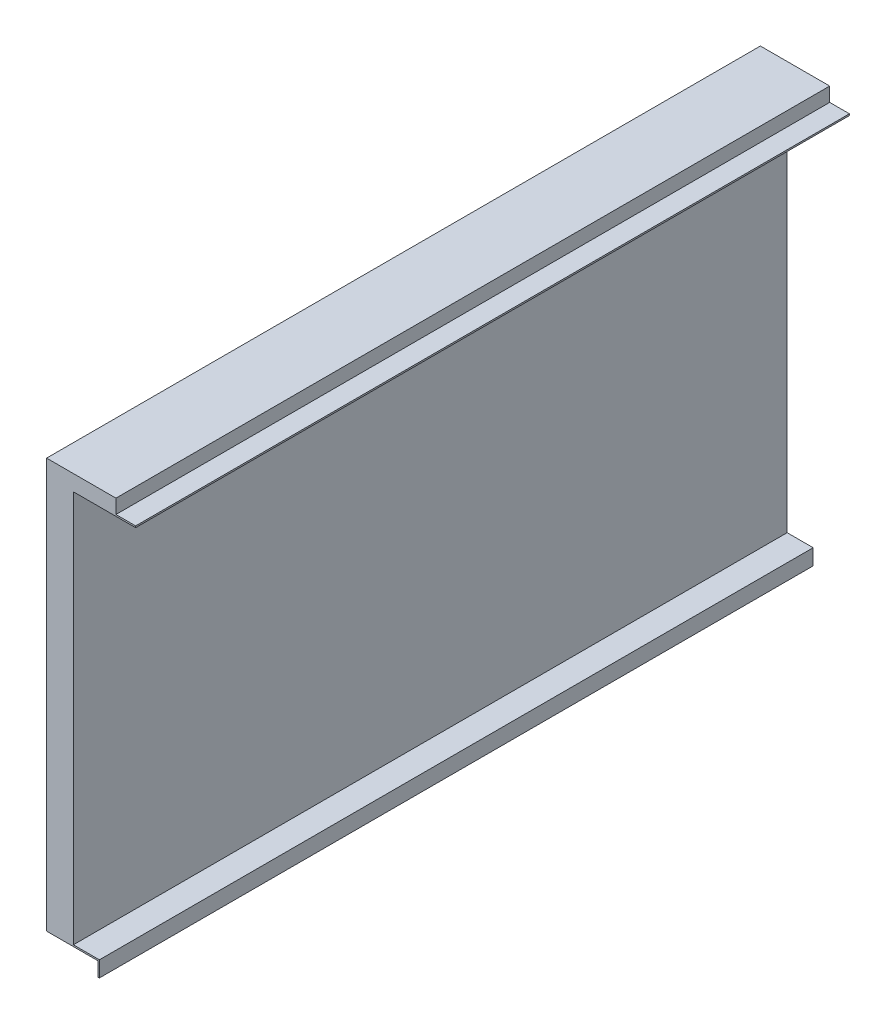
ISO-10303-21;
HEADER;
FILE_DESCRIPTION(('STEP AP214'),'2;1');
FILE_NAME('part.step','',(''),(''),'','','');
FILE_SCHEMA(('AUTOMOTIVE_DESIGN { 1 0 10303 214 1 1 1 1 }'));
ENDSEC;
DATA;
#1=APPLICATION_CONTEXT('core data for automotive mechanical design processes');
#2=APPLICATION_PROTOCOL_DEFINITION('international standard','automotive_design',2000,#1);
#3=PRODUCT_CONTEXT('',#1,'mechanical');
#4=PRODUCT('Part','Part','',(#3));
#5=PRODUCT_RELATED_PRODUCT_CATEGORY('part','',(#4));
#6=PRODUCT_DEFINITION_FORMATION('','',#4);
#7=PRODUCT_DEFINITION_CONTEXT('part definition',#1,'design');
#8=PRODUCT_DEFINITION('design','',#6,#7);
#9=PRODUCT_DEFINITION_SHAPE('','',#8);
#10=(LENGTH_UNIT() NAMED_UNIT(*) SI_UNIT(.MILLI.,.METRE.));
#11=(NAMED_UNIT(*) PLANE_ANGLE_UNIT() SI_UNIT($,.RADIAN.));
#12=(NAMED_UNIT(*) SI_UNIT($,.STERADIAN.) SOLID_ANGLE_UNIT());
#13=UNCERTAINTY_MEASURE_WITH_UNIT(LENGTH_MEASURE(1.E-05),#10,'distance_accuracy_value','');
#14=(GEOMETRIC_REPRESENTATION_CONTEXT(3) GLOBAL_UNCERTAINTY_ASSIGNED_CONTEXT((#13)) GLOBAL_UNIT_ASSIGNED_CONTEXT((#10,
#11,#12)) REPRESENTATION_CONTEXT('',''));
#15=CARTESIAN_POINT('',(0.,0.,0.));
#16=DIRECTION('',(0.,0.,1.));
#17=DIRECTION('',(1.,0.,0.));
#18=AXIS2_PLACEMENT_3D('',#15,#16,#17);
#19=CARTESIAN_POINT('',(-1370.,836.,1104.));
#20=DIRECTION('',(0.,0.,1.));
#21=DIRECTION('',(0.,-1.,0.));
#22=AXIS2_PLACEMENT_3D('',#19,#20,#21);
#23=PLANE('',#22);
#24=DIRECTION('',(-1.,0.,0.));
#25=VECTOR('',#24,1.);
#26=CARTESIAN_POINT('',(-1282.,1096.,1104.));
#27=LINE('',#26,#25);
#28=CARTESIAN_POINT('',(-1282.,1096.,1104.));
#29=VERTEX_POINT('',#28);
#30=CARTESIAN_POINT('',(-1370.,1096.,1104.));
#31=VERTEX_POINT('',#30);
#32=EDGE_CURVE('E95',#29,#31,#27,.T.);
#33=ORIENTED_EDGE('',*,*,#32,.F.);
#34=DIRECTION('',(0.,1.,0.));
#35=VECTOR('',#34,1.);
#36=CARTESIAN_POINT('',(-1282.,1078.,1104.));
#37=LINE('',#36,#35);
#38=CARTESIAN_POINT('',(-1282.,1078.,1104.));
#39=VERTEX_POINT('',#38);
#40=EDGE_CURVE('E36',#39,#29,#37,.T.);
#41=ORIENTED_EDGE('',*,*,#40,.F.);
#42=DIRECTION('',(-1.,0.,0.));
#43=VECTOR('',#42,1.);
#44=CARTESIAN_POINT('',(-1257.,1078.,1104.));
#45=LINE('',#44,#43);
#46=CARTESIAN_POINT('',(-1257.,1078.,1104.));
#47=VERTEX_POINT('',#46);
#48=EDGE_CURVE('E194',#47,#39,#45,.T.);
#49=ORIENTED_EDGE('',*,*,#48,.F.);
#50=DIRECTION('',(0.,1.,0.));
#51=VECTOR('',#50,1.);
#52=CARTESIAN_POINT('',(-1257.,1076.,1104.));
#53=LINE('',#52,#51);
#54=CARTESIAN_POINT('',(-1257.,1076.,1104.));
#55=VERTEX_POINT('',#54);
#56=EDGE_CURVE('E190',#55,#47,#53,.T.);
#57=ORIENTED_EDGE('',*,*,#56,.F.);
#58=DIRECTION('',(1.,0.,0.));
#59=VECTOR('',#58,1.);
#60=CARTESIAN_POINT('',(-1336.,1076.,1104.));
#61=LINE('',#60,#59);
#62=CARTESIAN_POINT('',(-1336.,1076.,1104.));
#63=VERTEX_POINT('',#62);
#64=EDGE_CURVE('E155',#63,#55,#61,.T.);
#65=ORIENTED_EDGE('',*,*,#64,.F.);
#66=DIRECTION('',(0.,1.,0.));
#67=VECTOR('',#66,1.);
#68=CARTESIAN_POINT('',(-1336.,578.,1104.));
#69=LINE('',#68,#67);
#70=CARTESIAN_POINT('',(-1336.,578.,1104.));
#71=VERTEX_POINT('',#70);
#72=EDGE_CURVE('E149',#71,#63,#69,.T.);
#73=ORIENTED_EDGE('',*,*,#72,.F.);
#74=DIRECTION('',(-1.,0.,0.));
#75=VECTOR('',#74,1.);
#76=CARTESIAN_POINT('',(-1303.,578.,1104.));
#77=LINE('',#76,#75);
#78=CARTESIAN_POINT('',(-1303.,578.,1104.));
#79=VERTEX_POINT('',#78);
#80=EDGE_CURVE('E146',#79,#71,#77,.T.);
#81=ORIENTED_EDGE('',*,*,#80,.F.);
#82=DIRECTION('',(0.,1.,0.));
#83=VECTOR('',#82,1.);
#84=CARTESIAN_POINT('',(-1303.,558.,1104.));
#85=LINE('',#84,#83);
#86=CARTESIAN_POINT('',(-1303.,558.,1104.));
#87=VERTEX_POINT('',#86);
#88=EDGE_CURVE('E137',#87,#79,#85,.T.);
#89=ORIENTED_EDGE('',*,*,#88,.F.);
#90=DIRECTION('',(1.,0.,0.));
#91=VECTOR('',#90,1.);
#92=CARTESIAN_POINT('',(-1305.,558.,1104.));
#93=LINE('',#92,#91);
#94=CARTESIAN_POINT('',(-1305.,558.,1104.));
#95=VERTEX_POINT('',#94);
#96=EDGE_CURVE('E121',#95,#87,#93,.T.);
#97=ORIENTED_EDGE('',*,*,#96,.F.);
#98=DIRECTION('',(0.,-1.,0.));
#99=VECTOR('',#98,1.);
#100=CARTESIAN_POINT('',(-1305.,576.,1104.));
#101=LINE('',#100,#99);
#102=CARTESIAN_POINT('',(-1305.,576.,1104.));
#103=VERTEX_POINT('',#102);
#104=EDGE_CURVE('E122',#103,#95,#101,.T.);
#105=ORIENTED_EDGE('',*,*,#104,.F.);
#106=DIRECTION('',(1.,0.,0.));
#107=VECTOR('',#106,1.);
#108=CARTESIAN_POINT('',(-1370.,576.,1104.));
#109=LINE('',#108,#107);
#110=CARTESIAN_POINT('',(-1370.,576.,1104.));
#111=VERTEX_POINT('',#110);
#112=EDGE_CURVE('E107',#111,#103,#109,.T.);
#113=ORIENTED_EDGE('',*,*,#112,.F.);
#114=DIRECTION('',(0.,-1.,0.));
#115=VECTOR('',#114,1.);
#116=CARTESIAN_POINT('',(-1370.,1096.,1104.));
#117=LINE('',#116,#115);
#118=EDGE_CURVE('E27',#31,#111,#117,.T.);
#119=ORIENTED_EDGE('',*,*,#118,.F.);
#120=EDGE_LOOP('',(#33,#41,#49,#57,#65,#73,#81,#89,#97,#105,#113,#119));
#121=FACE_BOUND('',#120,.T.);
#122=ADVANCED_FACE('F17',(#121),#23,.F.);
#123=CARTESIAN_POINT('',(-1370.,1096.,1104.));
#124=DIRECTION('',(-1.,0.,0.));
#125=DIRECTION('',(0.,-1.,0.));
#126=AXIS2_PLACEMENT_3D('',#123,#124,#125);
#127=PLANE('',#126);
#128=DIRECTION('',(0.,0.,1.));
#129=VECTOR('',#128,1.);
#130=CARTESIAN_POINT('',(-1370.,576.,1104.));
#131=LINE('',#130,#129);
#132=CARTESIAN_POINT('',(-1370.,576.,2010.));
#133=VERTEX_POINT('',#132);
#134=EDGE_CURVE('E11',#111,#133,#131,.T.);
#135=ORIENTED_EDGE('',*,*,#134,.T.);
#136=DIRECTION('',(0.,-1.,0.));
#137=VECTOR('',#136,1.);
#138=CARTESIAN_POINT('',(-1370.,1096.,2010.));
#139=LINE('',#138,#137);
#140=CARTESIAN_POINT('',(-1370.,1096.,2010.));
#141=VERTEX_POINT('',#140);
#142=EDGE_CURVE('E113',#141,#133,#139,.T.);
#143=ORIENTED_EDGE('',*,*,#142,.F.);
#144=DIRECTION('',(0.,0.,1.));
#145=VECTOR('',#144,1.);
#146=CARTESIAN_POINT('',(-1370.,1096.,1104.));
#147=LINE('',#146,#145);
#148=EDGE_CURVE('E99',#31,#141,#147,.T.);
#149=ORIENTED_EDGE('',*,*,#148,.F.);
#150=ORIENTED_EDGE('',*,*,#118,.T.);
#151=EDGE_LOOP('',(#135,#143,#149,#150));
#152=FACE_BOUND('',#151,.T.);
#153=ADVANCED_FACE('F112',(#152),#127,.T.);
#154=CARTESIAN_POINT('',(-1282.,1096.,1104.));
#155=DIRECTION('',(0.,1.,0.));
#156=DIRECTION('',(-1.,0.,0.));
#157=AXIS2_PLACEMENT_3D('',#154,#155,#156);
#158=PLANE('',#157);
#159=ORIENTED_EDGE('',*,*,#148,.T.);
#160=DIRECTION('',(-1.,0.,0.));
#161=VECTOR('',#160,1.);
#162=CARTESIAN_POINT('',(-1282.,1096.,2010.));
#163=LINE('',#162,#161);
#164=CARTESIAN_POINT('',(-1282.,1096.,2010.));
#165=VERTEX_POINT('',#164);
#166=EDGE_CURVE('E167',#165,#141,#163,.T.);
#167=ORIENTED_EDGE('',*,*,#166,.F.);
#168=DIRECTION('',(0.,0.,1.));
#169=VECTOR('',#168,1.);
#170=CARTESIAN_POINT('',(-1282.,1096.,1104.));
#171=LINE('',#170,#169);
#172=EDGE_CURVE('E101',#29,#165,#171,.T.);
#173=ORIENTED_EDGE('',*,*,#172,.F.);
#174=ORIENTED_EDGE('',*,*,#32,.T.);
#175=EDGE_LOOP('',(#159,#167,#173,#174));
#176=FACE_BOUND('',#175,.T.);
#177=ADVANCED_FACE('F97',(#176),#158,.T.);
#178=CARTESIAN_POINT('',(-1282.,1078.,1104.));
#179=DIRECTION('',(1.,0.,0.));
#180=DIRECTION('',(0.,0.,-1.));
#181=AXIS2_PLACEMENT_3D('',#178,#179,#180);
#182=PLANE('',#181);
#183=ORIENTED_EDGE('',*,*,#172,.T.);
#184=DIRECTION('',(0.,1.,0.));
#185=VECTOR('',#184,1.);
#186=CARTESIAN_POINT('',(-1282.,1078.,2010.));
#187=LINE('',#186,#185);
#188=CARTESIAN_POINT('',(-1282.,1078.,2010.));
#189=VERTEX_POINT('',#188);
#190=EDGE_CURVE('E163',#189,#165,#187,.T.);
#191=ORIENTED_EDGE('',*,*,#190,.F.);
#192=DIRECTION('',(0.,0.,1.));
#193=VECTOR('',#192,1.);
#194=CARTESIAN_POINT('',(-1282.,1078.,1104.));
#195=LINE('',#194,#193);
#196=EDGE_CURVE('E157',#39,#189,#195,.T.);
#197=ORIENTED_EDGE('',*,*,#196,.F.);
#198=ORIENTED_EDGE('',*,*,#40,.T.);
#199=EDGE_LOOP('',(#183,#191,#197,#198));
#200=FACE_BOUND('',#199,.T.);
#201=ADVANCED_FACE('F253',(#200),#182,.T.);
#202=CARTESIAN_POINT('',(-1257.,1078.,1104.));
#203=DIRECTION('',(0.,1.,0.));
#204=DIRECTION('',(-1.,0.,0.));
#205=AXIS2_PLACEMENT_3D('',#202,#203,#204);
#206=PLANE('',#205);
#207=ORIENTED_EDGE('',*,*,#196,.T.);
#208=DIRECTION('',(-1.,0.,0.));
#209=VECTOR('',#208,1.);
#210=CARTESIAN_POINT('',(-1257.,1078.,2010.));
#211=LINE('',#210,#209);
#212=CARTESIAN_POINT('',(-1257.,1078.,2010.));
#213=VERTEX_POINT('',#212);
#214=EDGE_CURVE('E166',#213,#189,#211,.T.);
#215=ORIENTED_EDGE('',*,*,#214,.F.);
#216=DIRECTION('',(0.,0.,1.));
#217=VECTOR('',#216,1.);
#218=CARTESIAN_POINT('',(-1257.,1078.,1104.));
#219=LINE('',#218,#217);
#220=EDGE_CURVE('E21',#47,#213,#219,.T.);
#221=ORIENTED_EDGE('',*,*,#220,.F.);
#222=ORIENTED_EDGE('',*,*,#48,.T.);
#223=EDGE_LOOP('',(#207,#215,#221,#222));
#224=FACE_BOUND('',#223,.T.);
#225=ADVANCED_FACE('F255',(#224),#206,.T.);
#226=CARTESIAN_POINT('',(-1257.,1076.,1104.));
#227=DIRECTION('',(1.,0.,0.));
#228=DIRECTION('',(0.,0.,-1.));
#229=AXIS2_PLACEMENT_3D('',#226,#227,#228);
#230=PLANE('',#229);
#231=ORIENTED_EDGE('',*,*,#220,.T.);
#232=DIRECTION('',(0.,1.,0.));
#233=VECTOR('',#232,1.);
#234=CARTESIAN_POINT('',(-1257.,1076.,2010.));
#235=LINE('',#234,#233);
#236=CARTESIAN_POINT('',(-1257.,1076.,2010.));
#237=VERTEX_POINT('',#236);
#238=EDGE_CURVE('E169',#237,#213,#235,.T.);
#239=ORIENTED_EDGE('',*,*,#238,.F.);
#240=DIRECTION('',(0.,0.,1.));
#241=VECTOR('',#240,1.);
#242=CARTESIAN_POINT('',(-1257.,1076.,1104.));
#243=LINE('',#242,#241);
#244=EDGE_CURVE('E160',#55,#237,#243,.T.);
#245=ORIENTED_EDGE('',*,*,#244,.F.);
#246=ORIENTED_EDGE('',*,*,#56,.T.);
#247=EDGE_LOOP('',(#231,#239,#245,#246));
#248=FACE_BOUND('',#247,.T.);
#249=ADVANCED_FACE('F250',(#248),#230,.T.);
#250=CARTESIAN_POINT('',(-1336.,1076.,1104.));
#251=DIRECTION('',(0.,-1.,0.));
#252=DIRECTION('',(0.,0.,1.));
#253=AXIS2_PLACEMENT_3D('',#250,#251,#252);
#254=PLANE('',#253);
#255=ORIENTED_EDGE('',*,*,#244,.T.);
#256=DIRECTION('',(1.,0.,0.));
#257=VECTOR('',#256,1.);
#258=CARTESIAN_POINT('',(-1336.,1076.,2010.));
#259=LINE('',#258,#257);
#260=CARTESIAN_POINT('',(-1336.,1076.,2010.));
#261=VERTEX_POINT('',#260);
#262=EDGE_CURVE('E142',#261,#237,#259,.T.);
#263=ORIENTED_EDGE('',*,*,#262,.F.);
#264=DIRECTION('',(0.,0.,1.));
#265=VECTOR('',#264,1.);
#266=CARTESIAN_POINT('',(-1336.,1076.,1104.));
#267=LINE('',#266,#265);
#268=EDGE_CURVE('E152',#63,#261,#267,.T.);
#269=ORIENTED_EDGE('',*,*,#268,.F.);
#270=ORIENTED_EDGE('',*,*,#64,.T.);
#271=EDGE_LOOP('',(#255,#263,#269,#270));
#272=FACE_BOUND('',#271,.T.);
#273=ADVANCED_FACE('F227',(#272),#254,.T.);
#274=CARTESIAN_POINT('',(-1336.,578.,1104.));
#275=DIRECTION('',(1.,0.,0.));
#276=DIRECTION('',(0.,0.,-1.));
#277=AXIS2_PLACEMENT_3D('',#274,#275,#276);
#278=PLANE('',#277);
#279=ORIENTED_EDGE('',*,*,#268,.T.);
#280=DIRECTION('',(0.,1.,0.));
#281=VECTOR('',#280,1.);
#282=CARTESIAN_POINT('',(-1336.,578.,2010.));
#283=LINE('',#282,#281);
#284=CARTESIAN_POINT('',(-1336.,578.,2010.));
#285=VERTEX_POINT('',#284);
#286=EDGE_CURVE('E139',#285,#261,#283,.T.);
#287=ORIENTED_EDGE('',*,*,#286,.F.);
#288=DIRECTION('',(0.,0.,1.));
#289=VECTOR('',#288,1.);
#290=CARTESIAN_POINT('',(-1336.,578.,1104.));
#291=LINE('',#290,#289);
#292=EDGE_CURVE('E148',#71,#285,#291,.T.);
#293=ORIENTED_EDGE('',*,*,#292,.F.);
#294=ORIENTED_EDGE('',*,*,#72,.T.);
#295=EDGE_LOOP('',(#279,#287,#293,#294));
#296=FACE_BOUND('',#295,.T.);
#297=ADVANCED_FACE('F224',(#296),#278,.T.);
#298=CARTESIAN_POINT('',(-1303.,578.,1104.));
#299=DIRECTION('',(0.,1.,0.));
#300=DIRECTION('',(-1.,0.,0.));
#301=AXIS2_PLACEMENT_3D('',#298,#299,#300);
#302=PLANE('',#301);
#303=ORIENTED_EDGE('',*,*,#292,.T.);
#304=DIRECTION('',(-1.,0.,0.));
#305=VECTOR('',#304,1.);
#306=CARTESIAN_POINT('',(-1303.,578.,2010.));
#307=LINE('',#306,#305);
#308=CARTESIAN_POINT('',(-1303.,578.,2010.));
#309=VERTEX_POINT('',#308);
#310=EDGE_CURVE('E132',#309,#285,#307,.T.);
#311=ORIENTED_EDGE('',*,*,#310,.F.);
#312=DIRECTION('',(0.,0.,1.));
#313=VECTOR('',#312,1.);
#314=CARTESIAN_POINT('',(-1303.,578.,1104.));
#315=LINE('',#314,#313);
#316=EDGE_CURVE('E143',#79,#309,#315,.T.);
#317=ORIENTED_EDGE('',*,*,#316,.F.);
#318=ORIENTED_EDGE('',*,*,#80,.T.);
#319=EDGE_LOOP('',(#303,#311,#317,#318));
#320=FACE_BOUND('',#319,.T.);
#321=ADVANCED_FACE('F19',(#320),#302,.T.);
#322=CARTESIAN_POINT('',(-1303.,558.,1104.));
#323=DIRECTION('',(1.,0.,0.));
#324=DIRECTION('',(0.,0.,-1.));
#325=AXIS2_PLACEMENT_3D('',#322,#323,#324);
#326=PLANE('',#325);
#327=ORIENTED_EDGE('',*,*,#316,.T.);
#328=DIRECTION('',(0.,1.,0.));
#329=VECTOR('',#328,1.);
#330=CARTESIAN_POINT('',(-1303.,558.,2010.));
#331=LINE('',#330,#329);
#332=CARTESIAN_POINT('',(-1303.,558.,2010.));
#333=VERTEX_POINT('',#332);
#334=EDGE_CURVE('E128',#333,#309,#331,.T.);
#335=ORIENTED_EDGE('',*,*,#334,.F.);
#336=DIRECTION('',(0.,0.,1.));
#337=VECTOR('',#336,1.);
#338=CARTESIAN_POINT('',(-1303.,558.,1104.));
#339=LINE('',#338,#337);
#340=EDGE_CURVE('E135',#87,#333,#339,.T.);
#341=ORIENTED_EDGE('',*,*,#340,.F.);
#342=ORIENTED_EDGE('',*,*,#88,.T.);
#343=EDGE_LOOP('',(#327,#335,#341,#342));
#344=FACE_BOUND('',#343,.T.);
#345=ADVANCED_FACE('F217',(#344),#326,.T.);
#346=CARTESIAN_POINT('',(-1305.,558.,1104.));
#347=DIRECTION('',(0.,-1.,0.));
#348=DIRECTION('',(0.,0.,1.));
#349=AXIS2_PLACEMENT_3D('',#346,#347,#348);
#350=PLANE('',#349);
#351=ORIENTED_EDGE('',*,*,#340,.T.);
#352=DIRECTION('',(1.,0.,0.));
#353=VECTOR('',#352,1.);
#354=CARTESIAN_POINT('',(-1305.,558.,2010.));
#355=LINE('',#354,#353);
#356=CARTESIAN_POINT('',(-1305.,558.,2010.));
#357=VERTEX_POINT('',#356);
#358=EDGE_CURVE('E131',#357,#333,#355,.T.);
#359=ORIENTED_EDGE('',*,*,#358,.F.);
#360=DIRECTION('',(0.,0.,1.));
#361=VECTOR('',#360,1.);
#362=CARTESIAN_POINT('',(-1305.,558.,1104.));
#363=LINE('',#362,#361);
#364=EDGE_CURVE('E118',#95,#357,#363,.T.);
#365=ORIENTED_EDGE('',*,*,#364,.F.);
#366=ORIENTED_EDGE('',*,*,#96,.T.);
#367=EDGE_LOOP('',(#351,#359,#365,#366));
#368=FACE_BOUND('',#367,.T.);
#369=ADVANCED_FACE('F232',(#368),#350,.T.);
#370=CARTESIAN_POINT('',(-1305.,576.,1104.));
#371=DIRECTION('',(-1.,0.,0.));
#372=DIRECTION('',(0.,-1.,0.));
#373=AXIS2_PLACEMENT_3D('',#370,#371,#372);
#374=PLANE('',#373);
#375=ORIENTED_EDGE('',*,*,#364,.T.);
#376=DIRECTION('',(0.,-1.,0.));
#377=VECTOR('',#376,1.);
#378=CARTESIAN_POINT('',(-1305.,576.,2010.));
#379=LINE('',#378,#377);
#380=CARTESIAN_POINT('',(-1305.,576.,2010.));
#381=VERTEX_POINT('',#380);
#382=EDGE_CURVE('E127',#381,#357,#379,.T.);
#383=ORIENTED_EDGE('',*,*,#382,.F.);
#384=DIRECTION('',(0.,0.,1.));
#385=VECTOR('',#384,1.);
#386=CARTESIAN_POINT('',(-1305.,576.,1104.));
#387=LINE('',#386,#385);
#388=EDGE_CURVE('E134',#103,#381,#387,.T.);
#389=ORIENTED_EDGE('',*,*,#388,.F.);
#390=ORIENTED_EDGE('',*,*,#104,.T.);
#391=EDGE_LOOP('',(#375,#383,#389,#390));
#392=FACE_BOUND('',#391,.T.);
#393=ADVANCED_FACE('F180',(#392),#374,.T.);
#394=CARTESIAN_POINT('',(-1370.,576.,1104.));
#395=DIRECTION('',(0.,-1.,0.));
#396=DIRECTION('',(0.,0.,1.));
#397=AXIS2_PLACEMENT_3D('',#394,#395,#396);
#398=PLANE('',#397);
#399=ORIENTED_EDGE('',*,*,#388,.T.);
#400=DIRECTION('',(1.,0.,0.));
#401=VECTOR('',#400,1.);
#402=CARTESIAN_POINT('',(-1370.,576.,2010.));
#403=LINE('',#402,#401);
#404=EDGE_CURVE('E124',#133,#381,#403,.T.);
#405=ORIENTED_EDGE('',*,*,#404,.F.);
#406=ORIENTED_EDGE('',*,*,#134,.F.);
#407=ORIENTED_EDGE('',*,*,#112,.T.);
#408=EDGE_LOOP('',(#399,#405,#406,#407));
#409=FACE_BOUND('',#408,.T.);
#410=ADVANCED_FACE('F174',(#409),#398,.T.);
#411=CARTESIAN_POINT('',(-1370.,836.,2010.));
#412=DIRECTION('',(0.,0.,1.));
#413=DIRECTION('',(0.,-1.,0.));
#414=AXIS2_PLACEMENT_3D('',#411,#412,#413);
#415=PLANE('',#414);
#416=ORIENTED_EDGE('',*,*,#404,.T.);
#417=ORIENTED_EDGE('',*,*,#382,.T.);
#418=ORIENTED_EDGE('',*,*,#358,.T.);
#419=ORIENTED_EDGE('',*,*,#334,.T.);
#420=ORIENTED_EDGE('',*,*,#310,.T.);
#421=ORIENTED_EDGE('',*,*,#286,.T.);
#422=ORIENTED_EDGE('',*,*,#262,.T.);
#423=ORIENTED_EDGE('',*,*,#238,.T.);
#424=ORIENTED_EDGE('',*,*,#214,.T.);
#425=ORIENTED_EDGE('',*,*,#190,.T.);
#426=ORIENTED_EDGE('',*,*,#166,.T.);
#427=ORIENTED_EDGE('',*,*,#142,.T.);
#428=EDGE_LOOP('',(#416,#417,#418,#419,#420,#421,#422,#423,#424,#425,#426,#427));
#429=FACE_BOUND('',#428,.T.);
#430=ADVANCED_FACE('F211',(#429),#415,.T.);
#431=CLOSED_SHELL('',(#122,#153,#177,#201,#225,#249,#273,#297,#321,#345,#369,#393,#410,#430));
#432=MANIFOLD_SOLID_BREP('B1',#431);
#433=ADVANCED_BREP_SHAPE_REPRESENTATION('',(#18,#432),#14);
#434=SHAPE_DEFINITION_REPRESENTATION(#9,#433);
ENDSEC;
END-ISO-10303-21;
